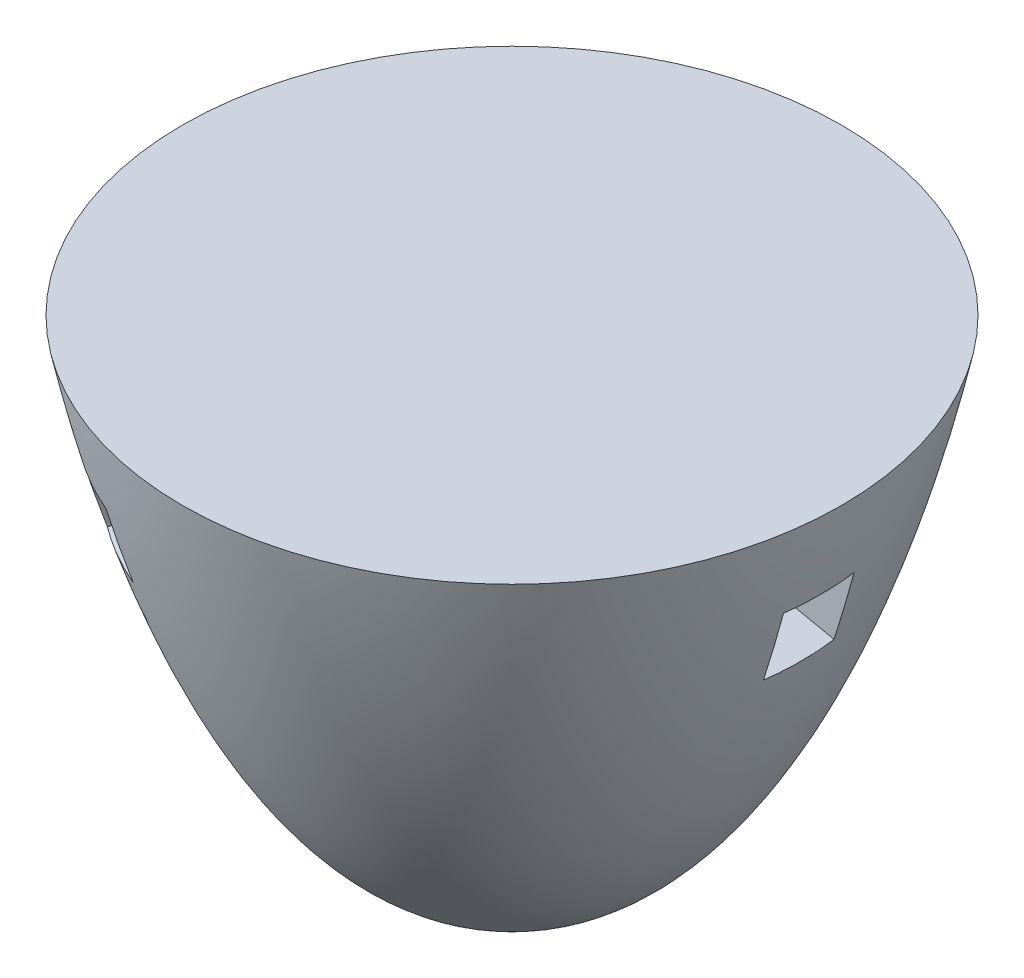
ISO-10303-21;
HEADER;
FILE_DESCRIPTION(('STEP AP214'),'2;1');
FILE_NAME('part.step','',(''),(''),'','','');
FILE_SCHEMA(('AUTOMOTIVE_DESIGN { 1 0 10303 214 1 1 1 1 }'));
ENDSEC;
DATA;
#1=APPLICATION_CONTEXT('core data for automotive mechanical design processes');
#2=APPLICATION_PROTOCOL_DEFINITION('international standard','automotive_design',2000,#1);
#3=PRODUCT_CONTEXT('',#1,'mechanical');
#4=PRODUCT('Part','Part','',(#3));
#5=PRODUCT_RELATED_PRODUCT_CATEGORY('part','',(#4));
#6=PRODUCT_DEFINITION_FORMATION('','',#4);
#7=PRODUCT_DEFINITION_CONTEXT('part definition',#1,'design');
#8=PRODUCT_DEFINITION('design','',#6,#7);
#9=PRODUCT_DEFINITION_SHAPE('','',#8);
#10=(LENGTH_UNIT() NAMED_UNIT(*) SI_UNIT(.MILLI.,.METRE.));
#11=(NAMED_UNIT(*) PLANE_ANGLE_UNIT() SI_UNIT($,.RADIAN.));
#12=(NAMED_UNIT(*) SI_UNIT($,.STERADIAN.) SOLID_ANGLE_UNIT());
#13=UNCERTAINTY_MEASURE_WITH_UNIT(LENGTH_MEASURE(1.E-05),#10,'distance_accuracy_value','');
#14=(GEOMETRIC_REPRESENTATION_CONTEXT(3) GLOBAL_UNCERTAINTY_ASSIGNED_CONTEXT((#13)) GLOBAL_UNIT_ASSIGNED_CONTEXT((#10,
#11,#12)) REPRESENTATION_CONTEXT('',''));
#15=CARTESIAN_POINT('',(0.,0.,0.));
#16=DIRECTION('',(0.,0.,1.));
#17=DIRECTION('',(1.,0.,0.));
#18=AXIS2_PLACEMENT_3D('',#15,#16,#17);
#19=CARTESIAN_POINT('',(-14.,4.86253392955283,0.));
#20=CARTESIAN_POINT('',(-12.0858284846915,-4.33132409028481,0.));
#21=CARTESIAN_POINT('',(-7.61517033654864,-16.3382936340164,0.));
#22=CARTESIAN_POINT('',(0.,-16.,0.));
#23=B_SPLINE_CURVE_WITH_KNOTS('',3,(#19,#20,#21,#22),.UNSPECIFIED.,.F.,.F.,(4,4),(0.,1.),.UNSPECIFIED.);
#24=CARTESIAN_POINT('',(0.,4.86253392955283,0.));
#25=DIRECTION('',(0.,1.,0.));
#26=AXIS1_PLACEMENT('',#24,#25);
#27=SURFACE_OF_REVOLUTION('',#23,#26);
#28=CARTESIAN_POINT('',(0.,-16.,0.));
#29=VERTEX_POINT('',#28);
#30=VERTEX_LOOP('',#29);
#31=FACE_BOUND('',#30,.T.);
#32=CARTESIAN_POINT('',(0.,4.86253392955283,0.));
#33=DIRECTION('',(0.,1.,0.));
#34=DIRECTION('',(0.,0.,1.));
#35=AXIS2_PLACEMENT_3D('',#32,#33,#34);
#36=CIRCLE('',#35,14.);
#37=CARTESIAN_POINT('',(0.,4.86253392955283,14.));
#38=VERTEX_POINT('',#37);
#39=EDGE_CURVE('E196',#38,#38,#36,.T.);
#40=ORIENTED_EDGE('',*,*,#39,.F.);
#41=EDGE_LOOP('',(#40));
#42=FACE_BOUND('',#41,.T.);
#43=CARTESIAN_POINT('',(12.1817851997561,-1.72014406167897,-1.5));
#44=CARTESIAN_POINT('',(12.1933029725772,-1.7225496808453,-1.40013050939504));
#45=CARTESIAN_POINT('',(12.2036705603734,-1.7247150706562,-1.3001225886177));
#46=CARTESIAN_POINT('',(12.2220799099767,-1.72856007480182,-1.10010500753433));
#47=CARTESIAN_POINT('',(12.2301267259048,-1.73024074474776,-1.00009583267158));
#48=CARTESIAN_POINT('',(12.2439083189674,-1.7331191887776,-0.800076680421048));
#49=CARTESIAN_POINT('',(12.2496468771971,-1.73431775258666,-0.700066974918155));
#50=CARTESIAN_POINT('',(12.2588224127801,-1.73623416859892,-0.500047461239616));
#51=CARTESIAN_POINT('',(12.2622619096121,-1.73695254702418,-0.400037773677909));
#52=CARTESIAN_POINT('',(12.2668460272514,-1.73790999265407,-0.200018703916229));
#53=CARTESIAN_POINT('',(12.2679919124719,-1.73814932394595,-0.100009351958114));
#54=CARTESIAN_POINT('',(12.2679919124719,-1.73814932394595,0.100009351958116));
#55=CARTESIAN_POINT('',(12.2668460272514,-1.73790999265407,0.200018703916231));
#56=CARTESIAN_POINT('',(12.2622619096121,-1.73695254702418,0.400037773677912));
#57=CARTESIAN_POINT('',(12.2588224127801,-1.73623416859892,0.500047461239619));
#58=CARTESIAN_POINT('',(12.2496468771971,-1.73431775258666,0.700066974918158));
#59=CARTESIAN_POINT('',(12.2439083189674,-1.7331191887776,0.800076680421051));
#60=CARTESIAN_POINT('',(12.2301267259048,-1.73024074474776,1.00009583267159));
#61=CARTESIAN_POINT('',(12.2220799099767,-1.72856007480182,1.10010500753434));
#62=CARTESIAN_POINT('',(12.2036705603733,-1.7247150706562,1.3001225886177));
#63=CARTESIAN_POINT('',(12.1933029725772,-1.7225496808453,1.40013050939505));
#64=CARTESIAN_POINT('',(12.1817851997561,-1.72014406167897,1.5));
#65=B_SPLINE_CURVE_WITH_KNOTS('',3,(#43,#44,#45,#46,#47,#48,#49,#50,#51,#52,#53,#54,#55,#56,#57,
#58,#59,#60,#61,#62,#63,#64),.UNSPECIFIED.,.F.,.F.,(4,2,2,2,2,2,2,2,2,2,4),(0.,
0.301673742349582,0.602685458449569,0.9032020674017,1.20338880609735,1.50341001338101,
1.80343122066467,2.10361795936031,2.40413456831245,2.70514628441243,3.00682002676201),.UNSPECIFIED.);
#66=CARTESIAN_POINT('',(12.1817851997561,-1.72014406167897,-1.5));
#67=VERTEX_POINT('',#66);
#68=CARTESIAN_POINT('',(12.1817851997561,-1.72014406167897,1.5));
#69=VERTEX_POINT('',#68);
#70=EDGE_CURVE('E212',#67,#69,#65,.T.);
#71=ORIENTED_EDGE('',*,*,#70,.T.);
#72=CARTESIAN_POINT('',(12.1451864829038,-1.83262485856913,1.5));
#73=CARTESIAN_POINT('',(12.1967145833269,-1.67483255379228,1.5));
#74=CARTESIAN_POINT('',(12.247531495718,-1.51680841090734,1.5));
#75=CARTESIAN_POINT('',(12.3477663451857,-1.2003532043508,1.5));
#76=CARTESIAN_POINT('',(12.3971845713483,-1.04192223225765,1.5));
#77=CARTESIAN_POINT('',(12.4946604295764,-0.724665383607132,1.5));
#78=CARTESIAN_POINT('',(12.5427182408058,-0.565839562075882,1.5));
#79=CARTESIAN_POINT('',(12.6375070114613,-0.247803297889641,1.5));
#80=CARTESIAN_POINT('',(12.6842380531336,-0.0885928797425492,1.5));
#81=CARTESIAN_POINT('',(12.7764030350186,0.230200953628136,1.5));
#82=CARTESIAN_POINT('',(12.821836989587,0.389784364702374,1.5));
#83=CARTESIAN_POINT('',(12.9114356574169,0.709319249462179,1.5));
#84=CARTESIAN_POINT('',(12.9556002803704,0.869270748465671,1.5));
#85=CARTESIAN_POINT('',(13.042684272269,1.1895352771757,1.5));
#86=CARTESIAN_POINT('',(13.0856034737628,1.34984835240309,1.5));
#87=CARTESIAN_POINT('',(13.170216575098,1.67083072414062,1.5));
#88=CARTESIAN_POINT('',(13.2119102363411,1.83150008355232,1.5));
#89=CARTESIAN_POINT('',(13.2529958885837,1.99232458843047,1.5));
#90=B_SPLINE_CURVE_WITH_KNOTS('',3,(#72,#73,#74,#75,#76,#77,#78,#79,#80,#81,#82,#83,#84,#85,#86,
#87,#88,#89),.UNSPECIFIED.,.F.,.F.,(4,2,2,2,2,2,2,2,4),(0.,0.49797566989374,0.995847653223589,
1.49365375989383,1.99142893996487,2.48919860865033,2.98700360448283,3.48487522468782,
3.98284314112315),.UNSPECIFIED.);
#91=CARTESIAN_POINT('',(13.0361613534745,1.16614588236891,1.5));
#92=VERTEX_POINT('',#91);
#93=EDGE_CURVE('E235',#69,#92,#90,.T.);
#94=ORIENTED_EDGE('',*,*,#93,.T.);
#95=CARTESIAN_POINT('',(13.0361613534745,1.1661458823689,1.5));
#96=CARTESIAN_POINT('',(13.0470421184762,1.16387330960342,1.40011635014103));
#97=CARTESIAN_POINT('',(13.056836146534,1.16182771433275,1.30010915719233));
#98=CARTESIAN_POINT('',(13.0742292517196,1.15819496450808,1.10009338389687));
#99=CARTESIAN_POINT('',(13.0818325942711,1.15660691907132,1.00008519062938));
#100=CARTESIAN_POINT('',(13.09485596393,1.15388683870959,0.800068163883786));
#101=CARTESIAN_POINT('',(13.1002791829399,1.1527541371191,0.700059547298926));
#102=CARTESIAN_POINT('',(13.1089511349224,1.15094290032682,0.500042232214074));
#103=CARTESIAN_POINT('',(13.1122019948836,1.15026392087904,0.400033629951474));
#104=CARTESIAN_POINT('',(13.1165348899604,1.14935894596729,0.200016669044369));
#105=CARTESIAN_POINT('',(13.117617992094,1.14913272764434,0.100008334522183));
#106=CARTESIAN_POINT('',(13.117617992094,1.14913272764434,-0.100008334522187));
#107=CARTESIAN_POINT('',(13.1165348899604,1.14935894596729,-0.200016669044373));
#108=CARTESIAN_POINT('',(13.1122019948836,1.15026392087904,-0.400033629951478));
#109=CARTESIAN_POINT('',(13.1089511349224,1.15094290032682,-0.500042232214078));
#110=CARTESIAN_POINT('',(13.1002791829399,1.1527541371191,-0.700059547298931));
#111=CARTESIAN_POINT('',(13.09485596393,1.15388683870959,-0.80006816388379));
#112=CARTESIAN_POINT('',(13.0818325942711,1.15660691907132,-1.00008519062938));
#113=CARTESIAN_POINT('',(13.0742292517196,1.15819496450808,-1.10009338389687));
#114=CARTESIAN_POINT('',(13.056836146534,1.16182771433275,-1.30010915719234));
#115=CARTESIAN_POINT('',(13.0470421184762,1.16387330960342,-1.40011635014103));
#116=CARTESIAN_POINT('',(13.0361613534745,1.16614588236891,-1.5));
#117=B_SPLINE_CURVE_WITH_KNOTS('',3,(#95,#96,#97,#98,#99,#100,#101,#102,#103,#104,#105,#106,
#107,#108,#109,#110,#111,#112,#113,#114,#115,#116),.UNSPECIFIED.,.F.,.F.,(4,2,2,2,2,2,2,2,2,2,
4),(0.,0.301494518893631,0.60239797646458,0.902859264845275,1.20302593444339,1.50304481903411,
1.80306370362483,2.10323037322294,2.40369166160363,2.70459511917458,3.00608963806821),.UNSPECIFIED.);
#118=CARTESIAN_POINT('',(13.0361613534745,1.16614588236891,-1.5));
#119=VERTEX_POINT('',#118);
#120=EDGE_CURVE('E242',#92,#119,#117,.T.);
#121=ORIENTED_EDGE('',*,*,#120,.T.);
#122=CARTESIAN_POINT('',(12.1451864829038,-1.83262485856912,-1.49999999999999));
#123=CARTESIAN_POINT('',(12.1967145833269,-1.67483255379228,-1.5));
#124=CARTESIAN_POINT('',(12.247531495718,-1.51680841090734,-1.5));
#125=CARTESIAN_POINT('',(12.3477663451857,-1.2003532043508,-1.5));
#126=CARTESIAN_POINT('',(12.3971845713483,-1.04192223225765,-1.5));
#127=CARTESIAN_POINT('',(12.4946604295764,-0.724665383607127,-1.5));
#128=CARTESIAN_POINT('',(12.5427182408058,-0.565839562075877,-1.5));
#129=CARTESIAN_POINT('',(12.6375070114613,-0.247803297889635,-1.5));
#130=CARTESIAN_POINT('',(12.6842380531336,-0.088592879742543,-1.5));
#131=CARTESIAN_POINT('',(12.7764030350186,0.230200953628142,-1.5));
#132=CARTESIAN_POINT('',(12.821836989587,0.38978436470238,-1.5));
#133=CARTESIAN_POINT('',(12.9114356574169,0.709319249462185,-1.5));
#134=CARTESIAN_POINT('',(12.9556002803704,0.869270748465677,-1.5));
#135=CARTESIAN_POINT('',(13.042684272269,1.18953527717571,-1.5));
#136=CARTESIAN_POINT('',(13.0856034737628,1.3498483524031,-1.5));
#137=CARTESIAN_POINT('',(13.170216575098,1.67083072414063,-1.5));
#138=CARTESIAN_POINT('',(13.2119102363411,1.83150008355233,-1.5));
#139=CARTESIAN_POINT('',(13.2529958885837,1.99232458843047,-1.5));
#140=B_SPLINE_CURVE_WITH_KNOTS('',3,(#122,#123,#124,#125,#126,#127,#128,#129,#130,#131,#132,
#133,#134,#135,#136,#137,#138,#139),.UNSPECIFIED.,.F.,.F.,(4,2,2,2,2,2,2,2,4),(0.,
0.49797566989374,0.99584765322359,1.49365375989383,1.99142893996488,2.48919860865034,
2.98700360448283,3.48487522468783,3.98284314112315),.UNSPECIFIED.);
#141=EDGE_CURVE('E206',#67,#119,#140,.T.);
#142=ORIENTED_EDGE('',*,*,#141,.F.);
#143=EDGE_LOOP('',(#71,#94,#121,#142));
#144=FACE_BOUND('',#143,.T.);
#145=CARTESIAN_POINT('',(-7.63260987910621,-1.7121133525864,-9.61522640808883));
#146=CARTESIAN_POINT('',(-7.51303232838039,-1.71647168969865,-9.70835981048873));
#147=CARTESIAN_POINT('',(-7.39182345030148,-1.72028539995271,-9.7994240650256));
#148=CARTESIAN_POINT('',(-7.14690271576581,-1.72680335314761,-9.9768639272215));
#149=CARTESIAN_POINT('',(-7.02320614423613,-1.72951297286003,-10.0632604358579));
#150=CARTESIAN_POINT('',(-6.77334956419813,-1.73383756120788,-10.2314238892728));
#151=CARTESIAN_POINT('',(-6.64720033342433,-1.73545653328941,-10.3132067447632));
#152=CARTESIAN_POINT('',(-6.39246826976671,-1.73761103900655,-10.4721876562738));
#153=CARTESIAN_POINT('',(-6.26389220444092,-1.73814923426124,-10.5493965199287));
#154=CARTESIAN_POINT('',(-6.00432543647193,-1.73814941349757,-10.6992584542048));
#155=CARTESIAN_POINT('',(-5.87333794052543,-1.73761273699068,-10.7719170789907));
#156=CARTESIAN_POINT('',(-5.60895445427025,-1.73546659230507,-10.912693894318));
#157=CARTESIAN_POINT('',(-5.47555847024265,-1.73385712692368,-10.9808120966981));
#158=CARTESIAN_POINT('',(-5.20635401035189,-1.72956490877745,-11.1125076345909));
#159=CARTESIAN_POINT('',(-5.07054273019197,-1.72688081840277,-11.1760791941264));
#160=CARTESIAN_POINT('',(-4.79649950914381,-1.7204350680048,-11.2986624879384));
#161=CARTESIAN_POINT('',(-4.65826241289367,-1.71667075977815,-11.357662557948));
#162=CARTESIAN_POINT('',(-4.3793517027935,-1.708056369661,-11.4710666713942));
#163=CARTESIAN_POINT('',(-4.23867096058271,-1.70320231766519,-11.5254528814781));
#164=CARTESIAN_POINT('',(-3.95484992186877,-1.69239671372701,-11.6295777460091));
#165=CARTESIAN_POINT('',(-3.8117008965556,-1.68643984706707,-11.6792920573714));
#166=CARTESIAN_POINT('',(-3.66775335694916,-1.67994579556333,-11.7264975395522));
#167=B_SPLINE_CURVE_WITH_KNOTS('',3,(#145,#146,#147,#148,#149,#150,#151,#152,#153,#154,#155,
#156,#157,#158,#159,#160,#161,#162,#163,#164,#165,#166),.UNSPECIFIED.,.F.,.F.,(4,2,2,2,2,2,2,2,
2,2,4),(0.,0.454865622169816,0.907488846118284,1.35844143630649,1.80828210106509,
2.25756252057623,2.70684176857736,3.15668199184459,3.60763458071054,4.06025751694822,
4.51512138063392),.UNSPECIFIED.);
#168=CARTESIAN_POINT('',(-7.38993070555474,-1.72014406167897,-9.79973544643401));
#169=VERTEX_POINT('',#168);
#170=CARTESIAN_POINT('',(-4.79185449420143,-1.72014406167897,-11.299735446434));
#171=VERTEX_POINT('',#170);
#172=EDGE_CURVE('E252',#169,#171,#167,.T.);
#173=ORIENTED_EDGE('',*,*,#172,.T.);
#174=CARTESIAN_POINT('',(-4.77355513577529,-1.83262485856913,-11.268040027894));
#175=CARTESIAN_POINT('',(-4.79931918598685,-1.67483255379228,-11.3126646718692));
#176=CARTESIAN_POINT('',(-4.82472764218241,-1.51680841090734,-11.3566734089418));
#177=CARTESIAN_POINT('',(-4.87484506691623,-1.2003532043508,-11.4434793349253));
#178=CARTESIAN_POINT('',(-4.89955417999754,-1.04192223225765,-11.4862767741921));
#179=CARTESIAN_POINT('',(-4.94829210911161,-0.724665383607126,-11.5706933436734));
#180=CARTESIAN_POINT('',(-4.97232101472629,-0.565839562075875,-11.6123126290482));
#181=CARTESIAN_POINT('',(-5.01971540005403,-0.247803297889632,-11.6944021124294));
#182=CARTESIAN_POINT('',(-5.04308092089021,-0.0885928797425387,-11.734872381663));
#183=CARTESIAN_POINT('',(-5.08916341183269,0.230200953628148,-11.8146895973147));
#184=CARTESIAN_POINT('',(-5.1118803891169,0.389784364702386,-11.8540365561653));
#185=CARTESIAN_POINT('',(-5.15667972303186,0.709319249462192,-11.9316312786513));
#186=CARTESIAN_POINT('',(-5.17876203450862,0.869270748465685,-11.9698789640776));
#187=CARTESIAN_POINT('',(-5.22230403045792,1.18953527717572,-12.0452959133247));
#188=CARTESIAN_POINT('',(-5.24376363120482,1.34984835240311,-12.0824650321285));
#189=CARTESIAN_POINT('',(-5.2860701818724,1.67083072414064,-12.1557421273777));
#190=CARTESIAN_POINT('',(-5.30691701249394,1.83150008355234,-12.191849897191));
#191=CARTESIAN_POINT('',(-5.32745983861524,1.99232458843049,-12.2274311157642));
#192=B_SPLINE_CURVE_WITH_KNOTS('',3,(#174,#175,#176,#177,#178,#179,#180,#181,#182,#183,#184,
#185,#186,#187,#188,#189,#190,#191),.UNSPECIFIED.,.F.,.F.,(4,2,2,2,2,2,2,2,4),(0.,
0.497975669893742,0.995847653223595,1.49365375989384,1.99142893996488,2.48919860865035,
2.98700360448285,3.48487522468784,3.98284314112317),.UNSPECIFIED.);
#193=CARTESIAN_POINT('',(-5.21904257106066,1.16614588236891,-12.0396468999418));
#194=VERTEX_POINT('',#193);
#195=EDGE_CURVE('E272',#171,#194,#192,.T.);
#196=ORIENTED_EDGE('',*,*,#195,.T.);
#197=CARTESIAN_POINT('',(-4.73061226627595,1.18021831267568,-12.2438421763985));
#198=CARTESIAN_POINT('',(-4.84536676173925,1.17644952772598,-12.1984245420479));
#199=CARTESIAN_POINT('',(-4.9595234672203,1.17302148230514,-12.1514682474254));
#200=CARTESIAN_POINT('',(-5.18622216350463,1.16685834000675,-12.0546569155867));
#201=CARTESIAN_POINT('',(-5.2987679202782,1.16412123161352,-12.0048108248453));
#202=CARTESIAN_POINT('',(-5.52225569664504,1.15933449623136,-11.9022437882423));
#203=CARTESIAN_POINT('',(-5.63320070809605,1.15728336493497,-11.8495294316651));
#204=CARTESIAN_POINT('',(-5.85349531502508,1.15386444890948,-11.7412439187797));
#205=CARTESIAN_POINT('',(-5.96284702094036,1.15249566146851,-11.6856770875495));
#206=CARTESIAN_POINT('',(-6.17996041000595,1.15043879203464,-11.5716981131395));
#207=CARTESIAN_POINT('',(-6.28772321234251,1.14975020590466,-11.5132881109428));
#208=CARTESIAN_POINT('',(-6.50166228610073,1.14905252461547,-11.3936274928737));
#209=CARTESIAN_POINT('',(-6.60783855676866,1.14904342977907,-11.332376875652));
#210=CARTESIAN_POINT('',(-6.81860459857541,1.14970498756226,-11.2070335914219));
#211=CARTESIAN_POINT('',(-6.92319313412745,1.15037614453893,-11.142938849418));
#212=CARTESIAN_POINT('',(-7.13077929083385,1.1523999066529,-11.0119004621239));
#213=CARTESIAN_POINT('',(-7.23377433618727,1.15375351605868,-10.9449527518275));
#214=CARTESIAN_POINT('',(-7.43816529255455,1.15714537422509,-10.8081955310669));
#215=CARTESIAN_POINT('',(-7.53955716121255,1.15918513115531,-10.7383800164715));
#216=CARTESIAN_POINT('',(-7.74073023591021,1.16395379874768,-10.5958688850221));
#217=CARTESIAN_POINT('',(-7.84050579695472,1.16668472808796,-10.5231653669507));
#218=CARTESIAN_POINT('',(-7.93928445975279,1.16975783267171,-10.4491456764556));
#219=B_SPLINE_CURVE_WITH_KNOTS('',3,(#197,#198,#199,#200,#201,#202,#203,#204,#205,#206,#207,
#208,#209,#210,#211,#212,#213,#214,#215,#216,#217,#218),.UNSPECIFIED.,.F.,.F.,(4,2,2,2,2,2,2,2,
2,2,4),(0.,0.370407212343926,0.73972329259335,1.10822409100864,1.47618176524817,
1.84386651940353,2.21155144823244,2.57950918816766,2.9480099867002,3.31732611015802,
3.68773358461613),.UNSPECIFIED.);
#220=CARTESIAN_POINT('',(-7.81711878241396,1.16614588236891,-10.5396468999418));
#221=VERTEX_POINT('',#220);
#222=EDGE_CURVE('E278',#194,#221,#219,.T.);
#223=ORIENTED_EDGE('',*,*,#222,.T.);
#224=CARTESIAN_POINT('',(-7.37163134712859,-1.83262485856913,-9.76804002789401));
#225=CARTESIAN_POINT('',(-7.39739539734015,-1.67483255379228,-9.8126646718692));
#226=CARTESIAN_POINT('',(-7.42280385353572,-1.51680841090734,-9.8566734089418));
#227=CARTESIAN_POINT('',(-7.47292127826954,-1.2003532043508,-9.94347933492529));
#228=CARTESIAN_POINT('',(-7.49763039135085,-1.04192223225765,-9.98627677419208));
#229=CARTESIAN_POINT('',(-7.54636832046493,-0.724665383607126,-10.0706933436733));
#230=CARTESIAN_POINT('',(-7.5703972260796,-0.565839562075875,-10.1123126290482));
#231=CARTESIAN_POINT('',(-7.61779161140733,-0.247803297889631,-10.1944021124294));
#232=CARTESIAN_POINT('',(-7.64115713224352,-0.088592879742537,-10.234872381663));
#233=CARTESIAN_POINT('',(-7.687239623186,0.23020095362815,-10.3146895973147));
#234=CARTESIAN_POINT('',(-7.70995660047021,0.389784364702388,-10.3540365561653));
#235=CARTESIAN_POINT('',(-7.75475593438517,0.709319249462195,-10.4316312786513));
#236=CARTESIAN_POINT('',(-7.77683824586193,0.869270748465689,-10.4698789640776));
#237=CARTESIAN_POINT('',(-7.82038024181123,1.18953527717572,-10.5452959133247));
#238=CARTESIAN_POINT('',(-7.84183984255813,1.34984835240311,-10.5824650321285));
#239=CARTESIAN_POINT('',(-7.88414639322571,1.67083072414064,-10.6557421273777));
#240=CARTESIAN_POINT('',(-7.90499322384726,1.83150008355235,-10.691849897191));
#241=CARTESIAN_POINT('',(-7.92553604996855,1.99232458843049,-10.7274311157642));
#242=B_SPLINE_CURVE_WITH_KNOTS('',3,(#224,#225,#226,#227,#228,#229,#230,#231,#232,#233,#234,
#235,#236,#237,#238,#239,#240,#241),.UNSPECIFIED.,.F.,.F.,(4,2,2,2,2,2,2,2,4),(0.,
0.497975669893743,0.995847653223597,1.49365375989384,1.99142893996489,2.48919860865035,
2.98700360448286,3.48487522468785,3.98284314112318),.UNSPECIFIED.);
#243=EDGE_CURVE('E241',#169,#221,#242,.T.);
#244=ORIENTED_EDGE('',*,*,#243,.F.);
#245=EDGE_LOOP('',(#173,#196,#223,#244));
#246=FACE_BOUND('',#245,.T.);
#247=CARTESIAN_POINT('',(-3.66775335694893,-1.67994579556332,11.7264975395523));
#248=CARTESIAN_POINT('',(-3.81170089655538,-1.68643984706707,11.6792920573715));
#249=CARTESIAN_POINT('',(-3.95484992186855,-1.692396713727,11.6295777460092));
#250=CARTESIAN_POINT('',(-4.2386709605825,-1.70320231766518,11.5254528814782));
#251=CARTESIAN_POINT('',(-4.37935170279329,-1.708056369661,11.4710666713942));
#252=CARTESIAN_POINT('',(-4.65826241289346,-1.71667075977815,11.3576625579481));
#253=CARTESIAN_POINT('',(-4.79649950914361,-1.7204350680048,11.2986624879385));
#254=CARTESIAN_POINT('',(-5.07054273019178,-1.72688081840277,11.1760791941265));
#255=CARTESIAN_POINT('',(-5.2063540103517,-1.72956490877745,11.112507634591));
#256=CARTESIAN_POINT('',(-5.47555847024246,-1.73385712692368,10.9808120966982));
#257=CARTESIAN_POINT('',(-5.60895445427006,-1.73546659230507,10.9126938943181));
#258=CARTESIAN_POINT('',(-5.87333794052525,-1.73761273699068,10.7719170789908));
#259=CARTESIAN_POINT('',(-6.00432543647175,-1.73814941349757,10.6992584542049));
#260=CARTESIAN_POINT('',(-6.26389220444074,-1.73814923426124,10.5493965199288));
#261=CARTESIAN_POINT('',(-6.39246826976654,-1.73761103900655,10.4721876562739));
#262=CARTESIAN_POINT('',(-6.64720033342417,-1.73545653328941,10.3132067447633));
#263=CARTESIAN_POINT('',(-6.77334956419797,-1.73383756120789,10.231423889273));
#264=CARTESIAN_POINT('',(-7.02320614423598,-1.72951297286003,10.063260435858));
#265=CARTESIAN_POINT('',(-7.14690271576566,-1.72680335314761,9.97686392722162));
#266=CARTESIAN_POINT('',(-7.39182345030133,-1.72028539995271,9.79942406502571));
#267=CARTESIAN_POINT('',(-7.51303232838024,-1.71647168969865,9.70835981048884));
#268=CARTESIAN_POINT('',(-7.63260987910607,-1.7121133525864,9.61522640808895));
#269=B_SPLINE_CURVE_WITH_KNOTS('',3,(#247,#248,#249,#250,#251,#252,#253,#254,#255,#256,#257,
#258,#259,#260,#261,#262,#263,#264,#265,#266,#267,#268),.UNSPECIFIED.,.F.,.F.,(4,2,2,2,2,2,2,2,
2,2,4),(0.,0.454863863685699,0.907486799923389,1.35843938878934,1.80827961205657,
2.25755886005771,2.70683927956885,3.15667994432746,3.60763253451567,4.06025575846414,
4.51512138063396),.UNSPECIFIED.);
#270=CARTESIAN_POINT('',(-4.79185449420127,-1.72014406167897,11.2997354464341));
#271=VERTEX_POINT('',#270);
#272=CARTESIAN_POINT('',(-7.3899307055546,-1.72014406167897,9.79973544643412));
#273=VERTEX_POINT('',#272);
#274=EDGE_CURVE('E287',#271,#273,#269,.T.);
#275=ORIENTED_EDGE('',*,*,#274,.T.);
#276=CARTESIAN_POINT('',(-7.37163134712846,-1.83262485856913,9.76804002789412));
#277=CARTESIAN_POINT('',(-7.39739539734002,-1.67483255379228,9.8126646718693));
#278=CARTESIAN_POINT('',(-7.42280385353558,-1.51680841090734,9.8566734089419));
#279=CARTESIAN_POINT('',(-7.4729212782694,-1.2003532043508,9.94347933492539));
#280=CARTESIAN_POINT('',(-7.49763039135071,-1.04192223225765,9.98627677419218));
#281=CARTESIAN_POINT('',(-7.54636832046479,-0.724665383607132,10.0706933436735));
#282=CARTESIAN_POINT('',(-7.57039722607946,-0.565839562075881,10.1123126290483));
#283=CARTESIAN_POINT('',(-7.61779161140719,-0.247803297889639,10.1944021124295));
#284=CARTESIAN_POINT('',(-7.64115713224338,-0.0885928797425465,10.2348723816631));
#285=CARTESIAN_POINT('',(-7.68723962318586,0.230200953628139,10.3146895973148));
#286=CARTESIAN_POINT('',(-7.70995660047006,0.389784364702376,10.3540365561654));
#287=CARTESIAN_POINT('',(-7.75475593438503,0.709319249462182,10.4316312786514));
#288=CARTESIAN_POINT('',(-7.77683824586178,0.869270748465674,10.4698789640777));
#289=CARTESIAN_POINT('',(-7.82038024181108,1.1895352771757,10.5452959133248));
#290=CARTESIAN_POINT('',(-7.84183984255798,1.34984835240309,10.5824650321286));
#291=CARTESIAN_POINT('',(-7.88414639322556,1.67083072414062,10.6557421273778));
#292=CARTESIAN_POINT('',(-7.90499322384711,1.83150008355232,10.6918498971911));
#293=CARTESIAN_POINT('',(-7.9255360499684,1.99232458843047,10.7274311157643));
#294=B_SPLINE_CURVE_WITH_KNOTS('',3,(#276,#277,#278,#279,#280,#281,#282,#283,#284,#285,#286,
#287,#288,#289,#290,#291,#292,#293),.UNSPECIFIED.,.F.,.F.,(4,2,2,2,2,2,2,2,4),(0.,
0.49797566989374,0.99584765322359,1.49365375989383,1.99142893996488,2.48919860865034,
2.98700360448283,3.48487522468783,3.98284314112315),.UNSPECIFIED.);
#295=CARTESIAN_POINT('',(-7.81711878241382,1.16614588236891,10.5396468999419));
#296=VERTEX_POINT('',#295);
#297=EDGE_CURVE('E11',#273,#296,#294,.T.);
#298=ORIENTED_EDGE('',*,*,#297,.T.);
#299=CARTESIAN_POINT('',(-7.93928445975264,1.16975783267171,10.4491456764557));
#300=CARTESIAN_POINT('',(-7.84050579695457,1.16668472808796,10.5231653669508));
#301=CARTESIAN_POINT('',(-7.74073023591006,1.16395379874768,10.5958688850222));
#302=CARTESIAN_POINT('',(-7.5395571612124,1.15918513115531,10.7383800164716));
#303=CARTESIAN_POINT('',(-7.43816529255439,1.15714537422509,10.808195531067));
#304=CARTESIAN_POINT('',(-7.23377433618711,1.15375351605868,10.9449527518277));
#305=CARTESIAN_POINT('',(-7.13077929083369,1.1523999066529,11.011900462124));
#306=CARTESIAN_POINT('',(-6.92319313412729,1.15037614453893,11.1429388494181));
#307=CARTESIAN_POINT('',(-6.81860459857525,1.14970498756226,11.207033591422));
#308=CARTESIAN_POINT('',(-6.6078385567685,1.14904342977907,11.3323768756521));
#309=CARTESIAN_POINT('',(-6.50166228610057,1.14905252461547,11.3936274928738));
#310=CARTESIAN_POINT('',(-6.28772321234235,1.14975020590466,11.5132881109429));
#311=CARTESIAN_POINT('',(-6.17996041000578,1.15043879203464,11.5716981131396));
#312=CARTESIAN_POINT('',(-5.96284702094019,1.15249566146851,11.6856770875495));
#313=CARTESIAN_POINT('',(-5.8534953150249,1.15386444890948,11.7412439187798));
#314=CARTESIAN_POINT('',(-5.63320070809587,1.15728336493497,11.8495294316652));
#315=CARTESIAN_POINT('',(-5.52225569664486,1.15933449623135,11.9022437882423));
#316=CARTESIAN_POINT('',(-5.29876792027802,1.16412123161352,12.0048108248454));
#317=CARTESIAN_POINT('',(-5.18622216350444,1.16685834000675,12.0546569155867));
#318=CARTESIAN_POINT('',(-4.95952346722011,1.17302148230514,12.1514682474255));
#319=CARTESIAN_POINT('',(-4.84536676173906,1.17644952772598,12.198424542048));
#320=CARTESIAN_POINT('',(-4.73061226627576,1.18021831267568,12.2438421763986));
#321=B_SPLINE_CURVE_WITH_KNOTS('',3,(#299,#300,#301,#302,#303,#304,#305,#306,#307,#308,#309,
#310,#311,#312,#313,#314,#315,#316,#317,#318,#319,#320),.UNSPECIFIED.,.F.,.F.,(4,2,2,2,2,2,2,2,
2,2,4),(0.,0.37040747445811,0.739723597915937,1.10822439644848,1.47618213638369,1.8438670652126,
2.21155181936797,2.5795094936075,2.94801029202279,3.31732637227222,3.68773358461615),.UNSPECIFIED.);
#322=CARTESIAN_POINT('',(-5.21904257106049,1.16614588236891,12.0396468999419));
#323=VERTEX_POINT('',#322);
#324=EDGE_CURVE('E46',#296,#323,#321,.T.);
#325=ORIENTED_EDGE('',*,*,#324,.T.);
#326=CARTESIAN_POINT('',(-4.77355513577513,-1.83262485856912,11.2680400278941));
#327=CARTESIAN_POINT('',(-4.79931918598669,-1.67483255379228,11.3126646718693));
#328=CARTESIAN_POINT('',(-4.82472764218225,-1.51680841090734,11.3566734089419));
#329=CARTESIAN_POINT('',(-4.87484506691607,-1.2003532043508,11.4434793349254));
#330=CARTESIAN_POINT('',(-4.89955417999738,-1.04192223225765,11.4862767741922));
#331=CARTESIAN_POINT('',(-4.94829210911146,-0.724665383607132,11.5706933436734));
#332=CARTESIAN_POINT('',(-4.97232101472613,-0.565839562075882,11.6123126290483));
#333=CARTESIAN_POINT('',(-5.01971540005386,-0.247803297889639,11.6944021124295));
#334=CARTESIAN_POINT('',(-5.04308092089005,-0.0885928797425467,11.734872381663));
#335=CARTESIAN_POINT('',(-5.08916341183253,0.230200953628138,11.8146895973147));
#336=CARTESIAN_POINT('',(-5.11188038911673,0.389784364702375,11.8540365561654));
#337=CARTESIAN_POINT('',(-5.1566797230317,0.70931924946218,11.9316312786513));
#338=CARTESIAN_POINT('',(-5.17876203450845,0.869270748465673,11.9698789640776));
#339=CARTESIAN_POINT('',(-5.22230403045775,1.1895352771757,12.0452959133248));
#340=CARTESIAN_POINT('',(-5.24376363120465,1.34984835240309,12.0824650321286));
#341=CARTESIAN_POINT('',(-5.28607018187223,1.67083072414062,12.1557421273778));
#342=CARTESIAN_POINT('',(-5.30691701249377,1.83150008355232,12.1918498971911));
#343=CARTESIAN_POINT('',(-5.32745983861506,1.99232458843047,12.2274311157642));
#344=B_SPLINE_CURVE_WITH_KNOTS('',3,(#326,#327,#328,#329,#330,#331,#332,#333,#334,#335,#336,
#337,#338,#339,#340,#341,#342,#343),.UNSPECIFIED.,.F.,.F.,(4,2,2,2,2,2,2,2,4),(0.,
0.49797566989374,0.99584765322359,1.49365375989383,1.99142893996487,2.48919860865033,
2.98700360448283,3.48487522468782,3.98284314112315),.UNSPECIFIED.);
#345=EDGE_CURVE('E136',#271,#323,#344,.T.);
#346=ORIENTED_EDGE('',*,*,#345,.F.);
#347=EDGE_LOOP('',(#275,#298,#325,#346));
#348=FACE_BOUND('',#347,.T.);
#349=ADVANCED_FACE('F33',(#31,#42,#144,#246,#348),#27,.F.);
#350=CARTESIAN_POINT('',(-14.,4.86253392955283,0.));
#351=DIRECTION('',(0.,1.,0.));
#352=DIRECTION('',(0.,0.,1.));
#353=AXIS2_PLACEMENT_3D('',#350,#351,#352);
#354=PLANE('',#353);
#355=ORIENTED_EDGE('',*,*,#39,.T.);
#356=EDGE_LOOP('',(#355));
#357=FACE_BOUND('',#356,.T.);
#358=ADVANCED_FACE('F307',(#357),#354,.T.);
#359=CARTESIAN_POINT('',(13.2199494816133,1.12775962050545,1.5));
#360=DIRECTION('',(-0.204449720431048,-0.978877066753362,0.));
#361=DIRECTION('',(0.978877066753362,-0.204449720431048,0.));
#362=AXIS2_PLACEMENT_3D('',#359,#360,#361);
#363=PLANE('',#362);
#364=DIRECTION('',(-0.978877066753362,0.204449720431048,0.));
#365=VECTOR('',#364,1.);
#366=CARTESIAN_POINT('',(13.2199494816133,1.12775962050545,1.5));
#367=LINE('',#366,#365);
#368=CARTESIAN_POINT('',(8.3255641478465,2.15000822266069,1.5));
#369=VERTEX_POINT('',#368);
#370=EDGE_CURVE('E185',#92,#369,#367,.T.);
#371=ORIENTED_EDGE('',*,*,#370,.T.);
#372=DIRECTION('',(0.,0.,-1.));
#373=VECTOR('',#372,1.);
#374=CARTESIAN_POINT('',(8.3255641478465,2.15000822266069,1.5));
#375=LINE('',#374,#373);
#376=CARTESIAN_POINT('',(8.3255641478465,2.15000822266069,-1.5));
#377=VERTEX_POINT('',#376);
#378=EDGE_CURVE('E194',#369,#377,#375,.T.);
#379=ORIENTED_EDGE('',*,*,#378,.T.);
#380=DIRECTION('',(-0.978877066753362,0.204449720431048,0.));
#381=VECTOR('',#380,1.);
#382=CARTESIAN_POINT('',(13.2199494816133,1.12775962050545,-1.5));
#383=LINE('',#382,#381);
#384=EDGE_CURVE('E178',#119,#377,#383,.T.);
#385=ORIENTED_EDGE('',*,*,#384,.F.);
#386=ORIENTED_EDGE('',*,*,#120,.F.);
#387=EDGE_LOOP('',(#371,#379,#385,#386));
#388=FACE_BOUND('',#387,.T.);
#389=ADVANCED_FACE('F312',(#388),#363,.T.);
#390=CARTESIAN_POINT('',(8.3255641478465,2.15000822266069,1.5));
#391=DIRECTION('',(0.978877066753362,-0.204449720431048,0.));
#392=DIRECTION('',(0.204449720431048,0.978877066753362,0.));
#393=AXIS2_PLACEMENT_3D('',#390,#391,#392);
#394=PLANE('',#393);
#395=ORIENTED_EDGE('',*,*,#378,.F.);
#396=DIRECTION('',(-0.204449720431048,-0.978877066753362,0.));
#397=VECTOR('',#396,1.);
#398=CARTESIAN_POINT('',(8.3255641478465,2.15000822266069,1.5));
#399=LINE('',#398,#397);
#400=CARTESIAN_POINT('',(7.71221498655336,-0.786622977599392,1.5));
#401=VERTEX_POINT('',#400);
#402=EDGE_CURVE('E187',#369,#401,#399,.T.);
#403=ORIENTED_EDGE('',*,*,#402,.T.);
#404=DIRECTION('',(0.,0.,-1.));
#405=VECTOR('',#404,1.);
#406=CARTESIAN_POINT('',(7.71221498655336,-0.786622977599392,1.5));
#407=LINE('',#406,#405);
#408=CARTESIAN_POINT('',(7.71221498655336,-0.786622977599392,-1.5));
#409=VERTEX_POINT('',#408);
#410=EDGE_CURVE('E192',#401,#409,#407,.T.);
#411=ORIENTED_EDGE('',*,*,#410,.T.);
#412=DIRECTION('',(-0.204449720431048,-0.978877066753362,0.));
#413=VECTOR('',#412,1.);
#414=CARTESIAN_POINT('',(8.3255641478465,2.15000822266069,-1.5));
#415=LINE('',#414,#413);
#416=EDGE_CURVE('E180',#377,#409,#415,.T.);
#417=ORIENTED_EDGE('',*,*,#416,.F.);
#418=EDGE_LOOP('',(#395,#403,#411,#417));
#419=FACE_BOUND('',#418,.T.);
#420=ADVANCED_FACE('F364',(#419),#394,.T.);
#421=CARTESIAN_POINT('',(12.6066003203202,-1.80887157975463,1.5));
#422=DIRECTION('',(0.204449720431048,0.978877066753362,0.));
#423=DIRECTION('',(-0.978877066753362,0.204449720431048,0.));
#424=AXIS2_PLACEMENT_3D('',#421,#422,#423);
#425=PLANE('',#424);
#426=DIRECTION('',(0.978877066753362,-0.204449720431048,0.));
#427=VECTOR('',#426,1.);
#428=CARTESIAN_POINT('',(12.6066003203202,-1.80887157975463,-1.5));
#429=LINE('',#428,#427);
#430=EDGE_CURVE('E183',#409,#67,#429,.T.);
#431=ORIENTED_EDGE('',*,*,#430,.F.);
#432=ORIENTED_EDGE('',*,*,#410,.F.);
#433=DIRECTION('',(0.978877066753362,-0.204449720431048,0.));
#434=VECTOR('',#433,1.);
#435=CARTESIAN_POINT('',(12.6066003203202,-1.80887157975463,1.5));
#436=LINE('',#435,#434);
#437=EDGE_CURVE('E189',#401,#69,#436,.T.);
#438=ORIENTED_EDGE('',*,*,#437,.T.);
#439=ORIENTED_EDGE('',*,*,#70,.F.);
#440=EDGE_LOOP('',(#431,#432,#438,#439));
#441=FACE_BOUND('',#440,.T.);
#442=ADVANCED_FACE('F230',(#441),#425,.T.);
#443=CARTESIAN_POINT('',(0.,0.,1.5));
#444=DIRECTION('',(0.,0.,-1.));
#445=DIRECTION('',(-1.,0.,0.));
#446=AXIS2_PLACEMENT_3D('',#443,#444,#445);
#447=PLANE('',#446);
#448=ORIENTED_EDGE('',*,*,#437,.F.);
#449=ORIENTED_EDGE('',*,*,#402,.F.);
#450=ORIENTED_EDGE('',*,*,#370,.F.);
#451=ORIENTED_EDGE('',*,*,#93,.F.);
#452=EDGE_LOOP('',(#448,#449,#450,#451));
#453=FACE_BOUND('',#452,.T.);
#454=ADVANCED_FACE('F224',(#453),#447,.T.);
#455=CARTESIAN_POINT('',(0.,0.,-1.5));
#456=DIRECTION('',(0.,0.,-1.));
#457=DIRECTION('',(-1.,0.,0.));
#458=AXIS2_PLACEMENT_3D('',#455,#456,#457);
#459=PLANE('',#458);
#460=ORIENTED_EDGE('',*,*,#141,.T.);
#461=ORIENTED_EDGE('',*,*,#384,.T.);
#462=ORIENTED_EDGE('',*,*,#416,.T.);
#463=ORIENTED_EDGE('',*,*,#430,.T.);
#464=EDGE_LOOP('',(#460,#461,#462,#463));
#465=FACE_BOUND('',#464,.T.);
#466=ADVANCED_FACE('F218',(#465),#459,.F.);
#467=CARTESIAN_POINT('',(-5.31093663513006,1.12775962050545,-12.198812087824));
#468=DIRECTION('',(0.102224860215525,-0.978877066753362,0.177058651689913));
#469=DIRECTION('',(0.,-0.17799109057646,-0.984032098905012));
#470=AXIS2_PLACEMENT_3D('',#467,#468,#469);
#471=PLANE('',#470);
#472=DIRECTION('',(0.489438533376685,0.204449720431048,0.847732406990405));
#473=VECTOR('',#472,1.);
#474=CARTESIAN_POINT('',(-5.31093663513006,1.12775962050545,-12.198812087824));
#475=LINE('',#474,#473);
#476=CARTESIAN_POINT('',(-2.86374396824663,2.15000822266069,-7.960150052872));
#477=VERTEX_POINT('',#476);
#478=EDGE_CURVE('E166',#194,#477,#475,.T.);
#479=ORIENTED_EDGE('',*,*,#478,.T.);
#480=DIRECTION('',(-0.866025403784436,0.,0.500000000000004));
#481=VECTOR('',#480,1.);
#482=CARTESIAN_POINT('',(-2.86374396824663,2.15000822266069,-7.960150052872));
#483=LINE('',#482,#481);
#484=CARTESIAN_POINT('',(-5.46182017959994,2.15000822266069,-6.46015005287199));
#485=VERTEX_POINT('',#484);
#486=EDGE_CURVE('E175',#477,#485,#483,.T.);
#487=ORIENTED_EDGE('',*,*,#486,.T.);
#488=DIRECTION('',(0.489438533376685,0.204449720431048,0.847732406990405));
#489=VECTOR('',#488,1.);
#490=CARTESIAN_POINT('',(-7.90901284648337,1.12775962050545,-10.698812087824));
#491=LINE('',#490,#489);
#492=EDGE_CURVE('E147',#221,#485,#491,.T.);
#493=ORIENTED_EDGE('',*,*,#492,.F.);
#494=ORIENTED_EDGE('',*,*,#222,.F.);
#495=EDGE_LOOP('',(#479,#487,#493,#494));
#496=FACE_BOUND('',#495,.T.);
#497=ADVANCED_FACE('F223',(#496),#471,.T.);
#498=CARTESIAN_POINT('',(-2.86374396824663,2.15000822266069,-7.960150052872));
#499=DIRECTION('',(-0.489438533376685,-0.204449720431048,-0.847732406990405));
#500=DIRECTION('',(-0.866025403784436,0.,0.500000000000004));
#501=AXIS2_PLACEMENT_3D('',#498,#499,#500);
#502=PLANE('',#501);
#503=ORIENTED_EDGE('',*,*,#486,.F.);
#504=DIRECTION('',(0.102224860215525,-0.978877066753362,0.177058651689913));
#505=VECTOR('',#504,1.);
#506=CARTESIAN_POINT('',(-2.86374396824663,2.15000822266069,-7.960150052872));
#507=LINE('',#506,#505);
#508=CARTESIAN_POINT('',(-2.55706938760006,-0.786622977599392,-7.42897409780226));
#509=VERTEX_POINT('',#508);
#510=EDGE_CURVE('E168',#477,#509,#507,.T.);
#511=ORIENTED_EDGE('',*,*,#510,.T.);
#512=DIRECTION('',(-0.866025403784436,0.,0.500000000000004));
#513=VECTOR('',#512,1.);
#514=CARTESIAN_POINT('',(-2.55706938760006,-0.786622977599392,-7.42897409780226));
#515=LINE('',#514,#513);
#516=CARTESIAN_POINT('',(-5.15514559895337,-0.786622977599392,-5.92897409780225));
#517=VERTEX_POINT('',#516);
#518=EDGE_CURVE('E173',#509,#517,#515,.T.);
#519=ORIENTED_EDGE('',*,*,#518,.T.);
#520=DIRECTION('',(0.102224860215525,-0.978877066753362,0.177058651689913));
#521=VECTOR('',#520,1.);
#522=CARTESIAN_POINT('',(-5.46182017959994,2.15000822266069,-6.46015005287199));
#523=LINE('',#522,#521);
#524=EDGE_CURVE('E163',#485,#517,#523,.T.);
#525=ORIENTED_EDGE('',*,*,#524,.F.);
#526=EDGE_LOOP('',(#503,#511,#519,#525));
#527=FACE_BOUND('',#526,.T.);
#528=ADVANCED_FACE('F339',(#527),#502,.T.);
#529=CARTESIAN_POINT('',(-5.00426205448348,-1.80887157975463,-11.6676361327543));
#530=DIRECTION('',(-0.102224860215525,0.978877066753362,-0.177058651689914));
#531=DIRECTION('',(0.,0.17799109057646,0.984032098905012));
#532=AXIS2_PLACEMENT_3D('',#529,#530,#531);
#533=PLANE('',#532);
#534=DIRECTION('',(-0.489438533376685,-0.204449720431048,-0.847732406990405));
#535=VECTOR('',#534,1.);
#536=CARTESIAN_POINT('',(-7.60233826583679,-1.80887157975463,-10.1676361327543));
#537=LINE('',#536,#535);
#538=EDGE_CURVE('E61',#517,#169,#537,.T.);
#539=ORIENTED_EDGE('',*,*,#538,.F.);
#540=ORIENTED_EDGE('',*,*,#518,.F.);
#541=DIRECTION('',(-0.489438533376685,-0.204449720431048,-0.847732406990405));
#542=VECTOR('',#541,1.);
#543=CARTESIAN_POINT('',(-5.00426205448348,-1.80887157975463,-11.6676361327543));
#544=LINE('',#543,#542);
#545=EDGE_CURVE('E170',#509,#171,#544,.T.);
#546=ORIENTED_EDGE('',*,*,#545,.T.);
#547=ORIENTED_EDGE('',*,*,#172,.F.);
#548=EDGE_LOOP('',(#539,#540,#546,#547));
#549=FACE_BOUND('',#548,.T.);
#550=ADVANCED_FACE('F268',(#549),#533,.T.);
#551=CARTESIAN_POINT('',(1.29903810567665,0.,-0.750000000000006));
#552=DIRECTION('',(-0.866025403784436,0.,0.500000000000004));
#553=DIRECTION('',(0.500000000000004,0.,0.866025403784436));
#554=AXIS2_PLACEMENT_3D('',#551,#552,#553);
#555=PLANE('',#554);
#556=ORIENTED_EDGE('',*,*,#545,.F.);
#557=ORIENTED_EDGE('',*,*,#510,.F.);
#558=ORIENTED_EDGE('',*,*,#478,.F.);
#559=ORIENTED_EDGE('',*,*,#195,.F.);
#560=EDGE_LOOP('',(#556,#557,#558,#559));
#561=FACE_BOUND('',#560,.T.);
#562=ADVANCED_FACE('F263',(#561),#555,.T.);
#563=CARTESIAN_POINT('',(-1.29903810567665,0.,0.750000000000006));
#564=DIRECTION('',(-0.866025403784436,0.,0.500000000000004));
#565=DIRECTION('',(0.500000000000004,0.,0.866025403784436));
#566=AXIS2_PLACEMENT_3D('',#563,#564,#565);
#567=PLANE('',#566);
#568=ORIENTED_EDGE('',*,*,#243,.T.);
#569=ORIENTED_EDGE('',*,*,#492,.T.);
#570=ORIENTED_EDGE('',*,*,#524,.T.);
#571=ORIENTED_EDGE('',*,*,#538,.T.);
#572=EDGE_LOOP('',(#568,#569,#570,#571));
#573=FACE_BOUND('',#572,.T.);
#574=ADVANCED_FACE('F258',(#573),#567,.F.);
#575=CARTESIAN_POINT('',(-7.90901284648321,1.12775962050545,10.6988120878241));
#576=DIRECTION('',(0.102224860215522,-0.978877066753362,-0.177058651689915));
#577=DIRECTION('',(0.,0.177991090576461,-0.984032098905011));
#578=AXIS2_PLACEMENT_3D('',#575,#576,#577);
#579=PLANE('',#578);
#580=DIRECTION('',(0.489438533376673,0.204449720431048,-0.847732406990412));
#581=VECTOR('',#580,1.);
#582=CARTESIAN_POINT('',(-7.90901284648321,1.12775962050545,10.6988120878241));
#583=LINE('',#582,#581);
#584=CARTESIAN_POINT('',(-5.46182017959985,2.15000822266069,6.46015005287206));
#585=VERTEX_POINT('',#584);
#586=EDGE_CURVE('E144',#296,#585,#583,.T.);
#587=ORIENTED_EDGE('',*,*,#586,.T.);
#588=DIRECTION('',(0.866025403784443,0.,0.499999999999992));
#589=VECTOR('',#588,1.);
#590=CARTESIAN_POINT('',(-5.46182017959985,2.15000822266069,6.46015005287206));
#591=LINE('',#590,#589);
#592=CARTESIAN_POINT('',(-2.86374396824652,2.15000822266069,7.96015005287204));
#593=VERTEX_POINT('',#592);
#594=EDGE_CURVE('E141',#585,#593,#591,.T.);
#595=ORIENTED_EDGE('',*,*,#594,.T.);
#596=DIRECTION('',(0.489438533376673,0.204449720431048,-0.847732406990412));
#597=VECTOR('',#596,1.);
#598=CARTESIAN_POINT('',(-5.31093663512988,1.12775962050545,12.1988120878241));
#599=LINE('',#598,#597);
#600=EDGE_CURVE('E130',#323,#593,#599,.T.);
#601=ORIENTED_EDGE('',*,*,#600,.F.);
#602=ORIENTED_EDGE('',*,*,#324,.F.);
#603=EDGE_LOOP('',(#587,#595,#601,#602));
#604=FACE_BOUND('',#603,.T.);
#605=ADVANCED_FACE('F142',(#604),#579,.T.);
#606=CARTESIAN_POINT('',(-5.46182017959985,2.15000822266069,6.46015005287206));
#607=DIRECTION('',(-0.489438533376673,-0.204449720431048,0.847732406990412));
#608=DIRECTION('',(0.866025403784443,0.,0.499999999999992));
#609=AXIS2_PLACEMENT_3D('',#606,#607,#608);
#610=PLANE('',#609);
#611=ORIENTED_EDGE('',*,*,#594,.F.);
#612=DIRECTION('',(0.102224860215522,-0.978877066753362,-0.177058651689915));
#613=VECTOR('',#612,1.);
#614=CARTESIAN_POINT('',(-5.46182017959985,2.15000822266069,6.46015005287206));
#615=LINE('',#614,#613);
#616=CARTESIAN_POINT('',(-5.15514559895328,-0.786622977599392,5.92897409780232));
#617=VERTEX_POINT('',#616);
#618=EDGE_CURVE('E156',#585,#617,#615,.T.);
#619=ORIENTED_EDGE('',*,*,#618,.T.);
#620=DIRECTION('',(0.866025403784443,0.,0.499999999999992));
#621=VECTOR('',#620,1.);
#622=CARTESIAN_POINT('',(-5.15514559895328,-0.786622977599392,5.92897409780232));
#623=LINE('',#622,#621);
#624=CARTESIAN_POINT('',(-2.55706938759995,-0.786622977599392,7.4289740978023));
#625=VERTEX_POINT('',#624);
#626=EDGE_CURVE('E148',#617,#625,#623,.T.);
#627=ORIENTED_EDGE('',*,*,#626,.T.);
#628=DIRECTION('',(0.102224860215522,-0.978877066753362,-0.177058651689915));
#629=VECTOR('',#628,1.);
#630=CARTESIAN_POINT('',(-2.86374396824652,2.15000822266069,7.96015005287204));
#631=LINE('',#630,#629);
#632=EDGE_CURVE('E134',#593,#625,#631,.T.);
#633=ORIENTED_EDGE('',*,*,#632,.F.);
#634=EDGE_LOOP('',(#611,#619,#627,#633));
#635=FACE_BOUND('',#634,.T.);
#636=ADVANCED_FACE('F150',(#635),#610,.T.);
#637=CARTESIAN_POINT('',(-7.60233826583665,-1.80887157975463,10.1676361327544));
#638=DIRECTION('',(-0.102224860215522,0.978877066753362,0.177058651689915));
#639=DIRECTION('',(0.,-0.177991090576461,0.984032098905011));
#640=AXIS2_PLACEMENT_3D('',#637,#638,#639);
#641=PLANE('',#640);
#642=DIRECTION('',(-0.489438533376673,-0.204449720431048,0.847732406990412));
#643=VECTOR('',#642,1.);
#644=CARTESIAN_POINT('',(-5.00426205448332,-1.80887157975463,11.6676361327544));
#645=LINE('',#644,#643);
#646=EDGE_CURVE('E53',#625,#271,#645,.T.);
#647=ORIENTED_EDGE('',*,*,#646,.F.);
#648=ORIENTED_EDGE('',*,*,#626,.F.);
#649=DIRECTION('',(-0.489438533376673,-0.204449720431048,0.847732406990412));
#650=VECTOR('',#649,1.);
#651=CARTESIAN_POINT('',(-7.60233826583665,-1.80887157975463,10.1676361327544));
#652=LINE('',#651,#650);
#653=EDGE_CURVE('E158',#617,#273,#652,.T.);
#654=ORIENTED_EDGE('',*,*,#653,.T.);
#655=ORIENTED_EDGE('',*,*,#274,.F.);
#656=EDGE_LOOP('',(#647,#648,#654,#655));
#657=FACE_BOUND('',#656,.T.);
#658=ADVANCED_FACE('F297',(#657),#641,.T.);
#659=CARTESIAN_POINT('',(-1.29903810567666,0.,-0.749999999999988));
#660=DIRECTION('',(0.866025403784443,0.,0.499999999999992));
#661=DIRECTION('',(0.499999999999992,0.,-0.866025403784443));
#662=AXIS2_PLACEMENT_3D('',#659,#660,#661);
#663=PLANE('',#662);
#664=ORIENTED_EDGE('',*,*,#653,.F.);
#665=ORIENTED_EDGE('',*,*,#618,.F.);
#666=ORIENTED_EDGE('',*,*,#586,.F.);
#667=ORIENTED_EDGE('',*,*,#297,.F.);
#668=EDGE_LOOP('',(#664,#665,#666,#667));
#669=FACE_BOUND('',#668,.T.);
#670=ADVANCED_FACE('F294',(#669),#663,.T.);
#671=CARTESIAN_POINT('',(1.29903810567666,0.,0.749999999999988));
#672=DIRECTION('',(0.866025403784443,0.,0.499999999999992));
#673=DIRECTION('',(0.499999999999992,0.,-0.866025403784443));
#674=AXIS2_PLACEMENT_3D('',#671,#672,#673);
#675=PLANE('',#674);
#676=ORIENTED_EDGE('',*,*,#345,.T.);
#677=ORIENTED_EDGE('',*,*,#600,.T.);
#678=ORIENTED_EDGE('',*,*,#632,.T.);
#679=ORIENTED_EDGE('',*,*,#646,.T.);
#680=EDGE_LOOP('',(#676,#677,#678,#679));
#681=FACE_BOUND('',#680,.T.);
#682=ADVANCED_FACE('F132',(#681),#675,.F.);
#683=CLOSED_SHELL('',(#349,#358,#389,#420,#442,#454,#466,#497,#528,#550,#562,#574,#605,#636,
#658,#670,#682));
#684=MANIFOLD_SOLID_BREP('B2',#683);
#685=ADVANCED_BREP_SHAPE_REPRESENTATION('',(#18,#684),#14);
#686=SHAPE_DEFINITION_REPRESENTATION(#9,#685);
ENDSEC;
END-ISO-10303-21;
